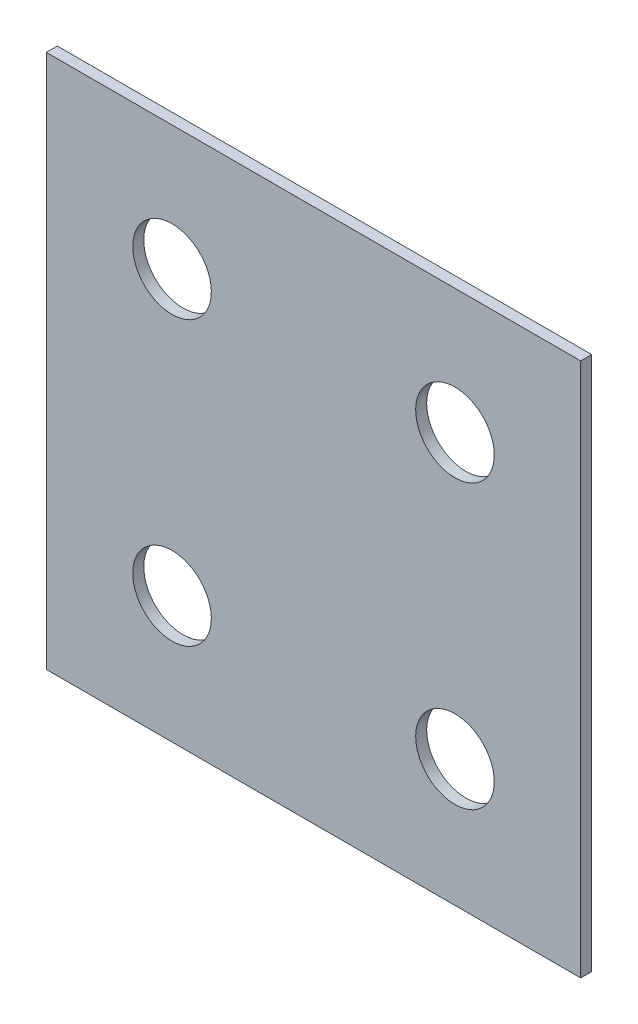
ISO-10303-21;
HEADER;
FILE_DESCRIPTION(('STEP AP214'),'2;1');
FILE_NAME('part.step','',(''),(''),'','','');
FILE_SCHEMA(('AUTOMOTIVE_DESIGN { 1 0 10303 214 1 1 1 1 }'));
ENDSEC;
DATA;
#1=APPLICATION_CONTEXT('core data for automotive mechanical design processes');
#2=APPLICATION_PROTOCOL_DEFINITION('international standard','automotive_design',2000,#1);
#3=PRODUCT_CONTEXT('',#1,'mechanical');
#4=PRODUCT('Part','Part','',(#3));
#5=PRODUCT_RELATED_PRODUCT_CATEGORY('part','',(#4));
#6=PRODUCT_DEFINITION_FORMATION('','',#4);
#7=PRODUCT_DEFINITION_CONTEXT('part definition',#1,'design');
#8=PRODUCT_DEFINITION('design','',#6,#7);
#9=PRODUCT_DEFINITION_SHAPE('','',#8);
#10=(LENGTH_UNIT() NAMED_UNIT(*) SI_UNIT(.MILLI.,.METRE.));
#11=(NAMED_UNIT(*) PLANE_ANGLE_UNIT() SI_UNIT($,.RADIAN.));
#12=(NAMED_UNIT(*) SI_UNIT($,.STERADIAN.) SOLID_ANGLE_UNIT());
#13=UNCERTAINTY_MEASURE_WITH_UNIT(LENGTH_MEASURE(1.E-05),#10,'distance_accuracy_value','');
#14=(GEOMETRIC_REPRESENTATION_CONTEXT(3) GLOBAL_UNCERTAINTY_ASSIGNED_CONTEXT((#13)) GLOBAL_UNIT_ASSIGNED_CONTEXT((#10,
#11,#12)) REPRESENTATION_CONTEXT('',''));
#15=CARTESIAN_POINT('',(0.,0.,0.));
#16=DIRECTION('',(0.,0.,1.));
#17=DIRECTION('',(1.,0.,0.));
#18=AXIS2_PLACEMENT_3D('',#15,#16,#17);
#19=CARTESIAN_POINT('',(149.6,-115.56,-0.045));
#20=DIRECTION('',(0.,0.,-1.));
#21=DIRECTION('',(0.,-1.,0.));
#22=AXIS2_PLACEMENT_3D('',#19,#20,#21);
#23=CYLINDRICAL_SURFACE('',#22,0.125);
#24=CARTESIAN_POINT('',(149.6,-115.56,1.6));
#25=DIRECTION('',(0.,0.,-1.));
#26=DIRECTION('',(0.,-1.,0.));
#27=AXIS2_PLACEMENT_3D('',#24,#25,#26);
#28=CIRCLE('',#27,0.125);
#29=CARTESIAN_POINT('',(149.6,-115.685,1.6));
#30=VERTEX_POINT('',#29);
#31=EDGE_CURVE('E153',#30,#30,#28,.T.);
#32=ORIENTED_EDGE('',*,*,#31,.T.);
#33=DIRECTION('',(0.,0.,1.));
#34=VECTOR('',#33,1.);
#35=CARTESIAN_POINT('',(149.6,-115.685,-0.045));
#36=LINE('',#35,#34);
#37=CARTESIAN_POINT('',(149.6,-115.685,1.635));
#38=VERTEX_POINT('',#37);
#39=EDGE_CURVE('E11',#30,#38,#36,.T.);
#40=ORIENTED_EDGE('',*,*,#39,.T.);
#41=CARTESIAN_POINT('',(149.6,-115.56,1.635));
#42=DIRECTION('',(0.,0.,-1.));
#43=DIRECTION('',(0.,-1.,0.));
#44=AXIS2_PLACEMENT_3D('',#41,#42,#43);
#45=CIRCLE('',#44,0.125);
#46=EDGE_CURVE('E186',#38,#38,#45,.T.);
#47=ORIENTED_EDGE('',*,*,#46,.F.);
#48=ORIENTED_EDGE('',*,*,#39,.F.);
#49=EDGE_LOOP('',(#32,#40,#47,#48));
#50=FACE_BOUND('',#49,.T.);
#51=ADVANCED_FACE('F17',(#50),#23,.F.);
#52=CARTESIAN_POINT('',(150.5,-115.56,-0.045));
#53=DIRECTION('',(0.,0.,-1.));
#54=DIRECTION('',(0.,-1.,0.));
#55=AXIS2_PLACEMENT_3D('',#52,#53,#54);
#56=CYLINDRICAL_SURFACE('',#55,0.125);
#57=CARTESIAN_POINT('',(150.5,-115.56,1.6));
#58=DIRECTION('',(0.,0.,-1.));
#59=DIRECTION('',(0.,-1.,0.));
#60=AXIS2_PLACEMENT_3D('',#57,#58,#59);
#61=CIRCLE('',#60,0.125);
#62=CARTESIAN_POINT('',(150.5,-115.685,1.6));
#63=VERTEX_POINT('',#62);
#64=EDGE_CURVE('E157',#63,#63,#61,.T.);
#65=ORIENTED_EDGE('',*,*,#64,.T.);
#66=DIRECTION('',(0.,0.,1.));
#67=VECTOR('',#66,1.);
#68=CARTESIAN_POINT('',(150.5,-115.685,-0.045));
#69=LINE('',#68,#67);
#70=CARTESIAN_POINT('',(150.5,-115.685,1.635));
#71=VERTEX_POINT('',#70);
#72=EDGE_CURVE('E27',#63,#71,#69,.T.);
#73=ORIENTED_EDGE('',*,*,#72,.T.);
#74=CARTESIAN_POINT('',(150.5,-115.56,1.635));
#75=DIRECTION('',(0.,0.,-1.));
#76=DIRECTION('',(0.,-1.,0.));
#77=AXIS2_PLACEMENT_3D('',#74,#75,#76);
#78=CIRCLE('',#77,0.125);
#79=EDGE_CURVE('E182',#71,#71,#78,.T.);
#80=ORIENTED_EDGE('',*,*,#79,.F.);
#81=ORIENTED_EDGE('',*,*,#72,.F.);
#82=EDGE_LOOP('',(#65,#73,#80,#81));
#83=FACE_BOUND('',#82,.T.);
#84=ADVANCED_FACE('F19',(#83),#56,.F.);
#85=CARTESIAN_POINT('',(149.6,-116.46,-0.045));
#86=DIRECTION('',(0.,0.,-1.));
#87=DIRECTION('',(0.,-1.,0.));
#88=AXIS2_PLACEMENT_3D('',#85,#86,#87);
#89=CYLINDRICAL_SURFACE('',#88,0.125);
#90=CARTESIAN_POINT('',(149.6,-116.46,1.6));
#91=DIRECTION('',(0.,0.,-1.));
#92=DIRECTION('',(0.,-1.,0.));
#93=AXIS2_PLACEMENT_3D('',#90,#91,#92);
#94=CIRCLE('',#93,0.125);
#95=CARTESIAN_POINT('',(149.6,-116.585,1.6));
#96=VERTEX_POINT('',#95);
#97=EDGE_CURVE('E170',#96,#96,#94,.T.);
#98=ORIENTED_EDGE('',*,*,#97,.T.);
#99=DIRECTION('',(0.,0.,1.));
#100=VECTOR('',#99,1.);
#101=CARTESIAN_POINT('',(149.6,-116.585,-0.045));
#102=LINE('',#101,#100);
#103=CARTESIAN_POINT('',(149.6,-116.585,1.635));
#104=VERTEX_POINT('',#103);
#105=EDGE_CURVE('E82',#96,#104,#102,.T.);
#106=ORIENTED_EDGE('',*,*,#105,.T.);
#107=CARTESIAN_POINT('',(149.6,-116.46,1.635));
#108=DIRECTION('',(0.,0.,-1.));
#109=DIRECTION('',(0.,-1.,0.));
#110=AXIS2_PLACEMENT_3D('',#107,#108,#109);
#111=CIRCLE('',#110,0.125);
#112=EDGE_CURVE('E179',#104,#104,#111,.T.);
#113=ORIENTED_EDGE('',*,*,#112,.F.);
#114=ORIENTED_EDGE('',*,*,#105,.F.);
#115=EDGE_LOOP('',(#98,#106,#113,#114));
#116=FACE_BOUND('',#115,.T.);
#117=ADVANCED_FACE('F331',(#116),#89,.F.);
#118=CARTESIAN_POINT('',(150.5,-116.46,-0.045));
#119=DIRECTION('',(0.,0.,-1.));
#120=DIRECTION('',(0.,-1.,0.));
#121=AXIS2_PLACEMENT_3D('',#118,#119,#120);
#122=CYLINDRICAL_SURFACE('',#121,0.125);
#123=CARTESIAN_POINT('',(150.5,-116.46,1.6));
#124=DIRECTION('',(0.,0.,-1.));
#125=DIRECTION('',(0.,-1.,0.));
#126=AXIS2_PLACEMENT_3D('',#123,#124,#125);
#127=CIRCLE('',#126,0.125);
#128=CARTESIAN_POINT('',(150.5,-116.585,1.6));
#129=VERTEX_POINT('',#128);
#130=EDGE_CURVE('E165',#129,#129,#127,.T.);
#131=ORIENTED_EDGE('',*,*,#130,.T.);
#132=DIRECTION('',(0.,0.,1.));
#133=VECTOR('',#132,1.);
#134=CARTESIAN_POINT('',(150.5,-116.585,-0.045));
#135=LINE('',#134,#133);
#136=CARTESIAN_POINT('',(150.5,-116.585,1.635));
#137=VERTEX_POINT('',#136);
#138=EDGE_CURVE('E93',#129,#137,#135,.T.);
#139=ORIENTED_EDGE('',*,*,#138,.T.);
#140=CARTESIAN_POINT('',(150.5,-116.46,1.635));
#141=DIRECTION('',(0.,0.,-1.));
#142=DIRECTION('',(0.,-1.,0.));
#143=AXIS2_PLACEMENT_3D('',#140,#141,#142);
#144=CIRCLE('',#143,0.125);
#145=EDGE_CURVE('E176',#137,#137,#144,.T.);
#146=ORIENTED_EDGE('',*,*,#145,.F.);
#147=ORIENTED_EDGE('',*,*,#138,.F.);
#148=EDGE_LOOP('',(#131,#139,#146,#147));
#149=FACE_BOUND('',#148,.T.);
#150=ADVANCED_FACE('F336',(#149),#122,.F.);
#151=CARTESIAN_POINT('',(149.2,-115.163,1.6));
#152=DIRECTION('',(0.,1.,0.));
#153=DIRECTION('',(1.,0.,0.));
#154=AXIS2_PLACEMENT_3D('',#151,#152,#153);
#155=PLANE('',#154);
#156=DIRECTION('',(0.,0.,1.));
#157=VECTOR('',#156,1.);
#158=CARTESIAN_POINT('',(149.2,-115.163,1.6));
#159=LINE('',#158,#157);
#160=CARTESIAN_POINT('',(149.2,-115.163,1.6));
#161=VERTEX_POINT('',#160);
#162=CARTESIAN_POINT('',(149.2,-115.163,1.635));
#163=VERTEX_POINT('',#162);
#164=EDGE_CURVE('E123',#161,#163,#159,.T.);
#165=ORIENTED_EDGE('',*,*,#164,.T.);
#166=DIRECTION('',(1.,0.,0.));
#167=VECTOR('',#166,1.);
#168=CARTESIAN_POINT('',(149.2,-115.163,1.635));
#169=LINE('',#168,#167);
#170=CARTESIAN_POINT('',(150.9,-115.163,1.635));
#171=VERTEX_POINT('',#170);
#172=EDGE_CURVE('E156',#163,#171,#169,.T.);
#173=ORIENTED_EDGE('',*,*,#172,.T.);
#174=DIRECTION('',(0.,0.,1.));
#175=VECTOR('',#174,1.);
#176=CARTESIAN_POINT('',(150.9,-115.163,1.6));
#177=LINE('',#176,#175);
#178=CARTESIAN_POINT('',(150.9,-115.163,1.6));
#179=VERTEX_POINT('',#178);
#180=EDGE_CURVE('E137',#179,#171,#177,.T.);
#181=ORIENTED_EDGE('',*,*,#180,.F.);
#182=DIRECTION('',(1.,0.,0.));
#183=VECTOR('',#182,1.);
#184=CARTESIAN_POINT('',(149.2,-115.163,1.6));
#185=LINE('',#184,#183);
#186=EDGE_CURVE('E126',#161,#179,#185,.T.);
#187=ORIENTED_EDGE('',*,*,#186,.F.);
#188=EDGE_LOOP('',(#165,#173,#181,#187));
#189=FACE_BOUND('',#188,.T.);
#190=ADVANCED_FACE('F202',(#189),#155,.T.);
#191=CARTESIAN_POINT('',(150.05,-116.013,1.635));
#192=DIRECTION('',(0.,0.,-1.));
#193=DIRECTION('',(0.,-1.,0.));
#194=AXIS2_PLACEMENT_3D('',#191,#192,#193);
#195=PLANE('',#194);
#196=ORIENTED_EDGE('',*,*,#46,.T.);
#197=EDGE_LOOP('',(#196));
#198=FACE_BOUND('',#197,.T.);
#199=ORIENTED_EDGE('',*,*,#79,.T.);
#200=EDGE_LOOP('',(#199));
#201=FACE_BOUND('',#200,.T.);
#202=ORIENTED_EDGE('',*,*,#112,.T.);
#203=EDGE_LOOP('',(#202));
#204=FACE_BOUND('',#203,.T.);
#205=ORIENTED_EDGE('',*,*,#145,.T.);
#206=EDGE_LOOP('',(#205));
#207=FACE_BOUND('',#206,.T.);
#208=DIRECTION('',(0.,-1.,0.));
#209=VECTOR('',#208,1.);
#210=CARTESIAN_POINT('',(150.9,-115.163,1.635));
#211=LINE('',#210,#209);
#212=CARTESIAN_POINT('',(150.9,-116.863,1.635));
#213=VERTEX_POINT('',#212);
#214=EDGE_CURVE('E150',#171,#213,#211,.T.);
#215=ORIENTED_EDGE('',*,*,#214,.F.);
#216=ORIENTED_EDGE('',*,*,#172,.F.);
#217=DIRECTION('',(0.,1.,0.));
#218=VECTOR('',#217,1.);
#219=CARTESIAN_POINT('',(149.2,-116.863,1.635));
#220=LINE('',#219,#218);
#221=CARTESIAN_POINT('',(149.2,-116.863,1.635));
#222=VERTEX_POINT('',#221);
#223=EDGE_CURVE('E109',#222,#163,#220,.T.);
#224=ORIENTED_EDGE('',*,*,#223,.F.);
#225=DIRECTION('',(-1.,0.,0.));
#226=VECTOR('',#225,1.);
#227=CARTESIAN_POINT('',(150.9,-116.863,1.635));
#228=LINE('',#227,#226);
#229=EDGE_CURVE('E140',#213,#222,#228,.T.);
#230=ORIENTED_EDGE('',*,*,#229,.F.);
#231=EDGE_LOOP('',(#215,#216,#224,#230));
#232=FACE_BOUND('',#231,.T.);
#233=ADVANCED_FACE('F199',(#198,#201,#204,#207,#232),#195,.F.);
#234=CARTESIAN_POINT('',(150.05,-116.013,1.6));
#235=DIRECTION('',(0.,0.,-1.));
#236=DIRECTION('',(0.,-1.,0.));
#237=AXIS2_PLACEMENT_3D('',#234,#235,#236);
#238=PLANE('',#237);
#239=ORIENTED_EDGE('',*,*,#31,.F.);
#240=EDGE_LOOP('',(#239));
#241=FACE_BOUND('',#240,.T.);
#242=ORIENTED_EDGE('',*,*,#64,.F.);
#243=EDGE_LOOP('',(#242));
#244=FACE_BOUND('',#243,.T.);
#245=ORIENTED_EDGE('',*,*,#97,.F.);
#246=EDGE_LOOP('',(#245));
#247=FACE_BOUND('',#246,.T.);
#248=ORIENTED_EDGE('',*,*,#130,.F.);
#249=EDGE_LOOP('',(#248));
#250=FACE_BOUND('',#249,.T.);
#251=DIRECTION('',(-1.,0.,0.));
#252=VECTOR('',#251,1.);
#253=CARTESIAN_POINT('',(150.9,-116.863,1.6));
#254=LINE('',#253,#252);
#255=CARTESIAN_POINT('',(150.9,-116.863,1.6));
#256=VERTEX_POINT('',#255);
#257=CARTESIAN_POINT('',(149.2,-116.863,1.6));
#258=VERTEX_POINT('',#257);
#259=EDGE_CURVE('E129',#256,#258,#254,.T.);
#260=ORIENTED_EDGE('',*,*,#259,.T.);
#261=DIRECTION('',(0.,1.,0.));
#262=VECTOR('',#261,1.);
#263=CARTESIAN_POINT('',(149.2,-116.863,1.6));
#264=LINE('',#263,#262);
#265=EDGE_CURVE('E116',#258,#161,#264,.T.);
#266=ORIENTED_EDGE('',*,*,#265,.T.);
#267=ORIENTED_EDGE('',*,*,#186,.T.);
#268=DIRECTION('',(0.,-1.,0.));
#269=VECTOR('',#268,1.);
#270=CARTESIAN_POINT('',(150.9,-115.163,1.6));
#271=LINE('',#270,#269);
#272=EDGE_CURVE('E132',#179,#256,#271,.T.);
#273=ORIENTED_EDGE('',*,*,#272,.T.);
#274=EDGE_LOOP('',(#260,#266,#267,#273));
#275=FACE_BOUND('',#274,.T.);
#276=ADVANCED_FACE('F130',(#241,#244,#247,#250,#275),#238,.T.);
#277=CARTESIAN_POINT('',(149.2,-116.863,1.6));
#278=DIRECTION('',(-1.,0.,0.));
#279=DIRECTION('',(0.,0.,1.));
#280=AXIS2_PLACEMENT_3D('',#277,#278,#279);
#281=PLANE('',#280);
#282=DIRECTION('',(0.,0.,1.));
#283=VECTOR('',#282,1.);
#284=CARTESIAN_POINT('',(149.2,-116.863,1.6));
#285=LINE('',#284,#283);
#286=EDGE_CURVE('E120',#258,#222,#285,.T.);
#287=ORIENTED_EDGE('',*,*,#286,.T.);
#288=ORIENTED_EDGE('',*,*,#223,.T.);
#289=ORIENTED_EDGE('',*,*,#164,.F.);
#290=ORIENTED_EDGE('',*,*,#265,.F.);
#291=EDGE_LOOP('',(#287,#288,#289,#290));
#292=FACE_BOUND('',#291,.T.);
#293=ADVANCED_FACE('F118',(#292),#281,.T.);
#294=CARTESIAN_POINT('',(150.9,-115.163,1.6));
#295=DIRECTION('',(1.,0.,0.));
#296=DIRECTION('',(0.,1.,0.));
#297=AXIS2_PLACEMENT_3D('',#294,#295,#296);
#298=PLANE('',#297);
#299=ORIENTED_EDGE('',*,*,#180,.T.);
#300=ORIENTED_EDGE('',*,*,#214,.T.);
#301=DIRECTION('',(0.,0.,1.));
#302=VECTOR('',#301,1.);
#303=CARTESIAN_POINT('',(150.9,-116.863,1.6));
#304=LINE('',#303,#302);
#305=EDGE_CURVE('E147',#256,#213,#304,.T.);
#306=ORIENTED_EDGE('',*,*,#305,.F.);
#307=ORIENTED_EDGE('',*,*,#272,.F.);
#308=EDGE_LOOP('',(#299,#300,#306,#307));
#309=FACE_BOUND('',#308,.T.);
#310=ADVANCED_FACE('F210',(#309),#298,.T.);
#311=CARTESIAN_POINT('',(150.9,-116.863,1.6));
#312=DIRECTION('',(0.,-1.,0.));
#313=DIRECTION('',(0.,0.,-1.));
#314=AXIS2_PLACEMENT_3D('',#311,#312,#313);
#315=PLANE('',#314);
#316=ORIENTED_EDGE('',*,*,#305,.T.);
#317=ORIENTED_EDGE('',*,*,#229,.T.);
#318=ORIENTED_EDGE('',*,*,#286,.F.);
#319=ORIENTED_EDGE('',*,*,#259,.F.);
#320=EDGE_LOOP('',(#316,#317,#318,#319));
#321=FACE_BOUND('',#320,.T.);
#322=ADVANCED_FACE('F139',(#321),#315,.T.);
#323=CLOSED_SHELL('',(#51,#84,#117,#150,#190,#233,#276,#293,#310,#322));
#324=MANIFOLD_SOLID_BREP('B1',#323);
#325=ADVANCED_BREP_SHAPE_REPRESENTATION('',(#18,#324),#14);
#326=SHAPE_DEFINITION_REPRESENTATION(#9,#325);
ENDSEC;
END-ISO-10303-21;
